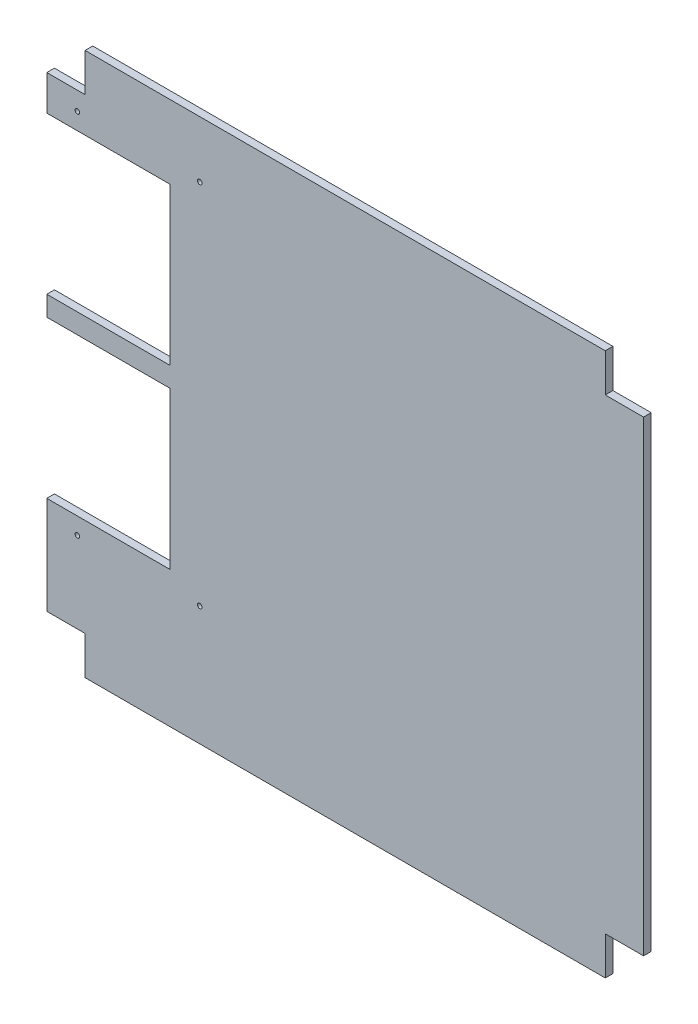
ISO-10303-21;
HEADER;
FILE_DESCRIPTION(('STEP AP214'),'2;1');
FILE_NAME('part.step','',(''),(''),'','','');
FILE_SCHEMA(('AUTOMOTIVE_DESIGN { 1 0 10303 214 1 1 1 1 }'));
ENDSEC;
DATA;
#1=APPLICATION_CONTEXT('core data for automotive mechanical design processes');
#2=APPLICATION_PROTOCOL_DEFINITION('international standard','automotive_design',2000,#1);
#3=PRODUCT_CONTEXT('',#1,'mechanical');
#4=PRODUCT('Part','Part','',(#3));
#5=PRODUCT_RELATED_PRODUCT_CATEGORY('part','',(#4));
#6=PRODUCT_DEFINITION_FORMATION('','',#4);
#7=PRODUCT_DEFINITION_CONTEXT('part definition',#1,'design');
#8=PRODUCT_DEFINITION('design','',#6,#7);
#9=PRODUCT_DEFINITION_SHAPE('','',#8);
#10=(LENGTH_UNIT() NAMED_UNIT(*) SI_UNIT(.MILLI.,.METRE.));
#11=(NAMED_UNIT(*) PLANE_ANGLE_UNIT() SI_UNIT($,.RADIAN.));
#12=(NAMED_UNIT(*) SI_UNIT($,.STERADIAN.) SOLID_ANGLE_UNIT());
#13=UNCERTAINTY_MEASURE_WITH_UNIT(LENGTH_MEASURE(1.E-05),#10,'distance_accuracy_value','');
#14=(GEOMETRIC_REPRESENTATION_CONTEXT(3) GLOBAL_UNCERTAINTY_ASSIGNED_CONTEXT((#13)) GLOBAL_UNIT_ASSIGNED_CONTEXT((#10,
#11,#12)) REPRESENTATION_CONTEXT('',''));
#15=CARTESIAN_POINT('',(0.,0.,0.));
#16=DIRECTION('',(0.,0.,1.));
#17=DIRECTION('',(1.,0.,0.));
#18=AXIS2_PLACEMENT_3D('',#15,#16,#17);
#19=CARTESIAN_POINT('',(-195.,177.5,5.));
#20=DIRECTION('',(1.,0.,0.));
#21=DIRECTION('',(0.,1.,0.));
#22=AXIS2_PLACEMENT_3D('',#19,#20,#21);
#23=PLANE('',#22);
#24=DIRECTION('',(0.,-1.,0.));
#25=VECTOR('',#24,1.);
#26=CARTESIAN_POINT('',(-195.,177.5,0.));
#27=LINE('',#26,#25);
#28=CARTESIAN_POINT('',(-195.,27.,0.));
#29=VERTEX_POINT('',#28);
#30=CARTESIAN_POINT('',(-195.,13.9988010097694,0.));
#31=VERTEX_POINT('',#30);
#32=EDGE_CURVE('E195',#29,#31,#27,.T.);
#33=ORIENTED_EDGE('',*,*,#32,.T.);
#34=DIRECTION('',(0.,0.,-1.));
#35=VECTOR('',#34,1.);
#36=CARTESIAN_POINT('',(-195.,13.9988010097694,5.));
#37=LINE('',#36,#35);
#38=CARTESIAN_POINT('',(-195.,13.9988010097694,5.));
#39=VERTEX_POINT('',#38);
#40=EDGE_CURVE('E191',#39,#31,#37,.T.);
#41=ORIENTED_EDGE('',*,*,#40,.F.);
#42=DIRECTION('',(0.,-1.,0.));
#43=VECTOR('',#42,1.);
#44=CARTESIAN_POINT('',(-195.,177.5,5.));
#45=LINE('',#44,#43);
#46=CARTESIAN_POINT('',(-195.,27.,5.));
#47=VERTEX_POINT('',#46);
#48=EDGE_CURVE('E175',#47,#39,#45,.T.);
#49=ORIENTED_EDGE('',*,*,#48,.F.);
#50=DIRECTION('',(0.,0.,-1.));
#51=VECTOR('',#50,1.);
#52=CARTESIAN_POINT('',(-195.,27.,10.));
#53=LINE('',#52,#51);
#54=EDGE_CURVE('E271',#47,#29,#53,.T.);
#55=ORIENTED_EDGE('',*,*,#54,.T.);
#56=EDGE_LOOP('',(#33,#41,#49,#55));
#57=FACE_BOUND('',#56,.T.);
#58=ADVANCED_FACE('F36',(#57),#23,.F.);
#59=CARTESIAN_POINT('',(-195.,152.47,5.));
#60=VERTEX_POINT('',#59);
#61=CARTESIAN_POINT('',(-195.,129.5,5.));
#62=VERTEX_POINT('',#61);
#63=EDGE_CURVE('E45',#60,#62,#45,.T.);
#64=ORIENTED_EDGE('',*,*,#63,.F.);
#65=DIRECTION('',(0.,0.,-1.));
#66=VECTOR('',#65,1.);
#67=CARTESIAN_POINT('',(-195.,152.47,10.));
#68=LINE('',#67,#66);
#69=CARTESIAN_POINT('',(-195.,152.47,0.));
#70=VERTEX_POINT('',#69);
#71=EDGE_CURVE('E223',#60,#70,#68,.T.);
#72=ORIENTED_EDGE('',*,*,#71,.T.);
#73=CARTESIAN_POINT('',(-195.,129.5,0.));
#74=VERTEX_POINT('',#73);
#75=EDGE_CURVE('E313',#70,#74,#27,.T.);
#76=ORIENTED_EDGE('',*,*,#75,.T.);
#77=DIRECTION('',(0.,0.,-1.));
#78=VECTOR('',#77,1.);
#79=CARTESIAN_POINT('',(-195.,129.5,10.));
#80=LINE('',#79,#78);
#81=EDGE_CURVE('E269',#62,#74,#80,.T.);
#82=ORIENTED_EDGE('',*,*,#81,.F.);
#83=EDGE_LOOP('',(#64,#72,#76,#82));
#84=FACE_BOUND('',#83,.T.);
#85=ADVANCED_FACE('F376',(#84),#23,.F.);
#86=CARTESIAN_POINT('',(195.,177.5,5.));
#87=DIRECTION('',(-1.,0.,0.));
#88=DIRECTION('',(0.,-1.,0.));
#89=AXIS2_PLACEMENT_3D('',#86,#87,#88);
#90=PLANE('',#89);
#91=DIRECTION('',(0.,1.,0.));
#92=VECTOR('',#91,1.);
#93=CARTESIAN_POINT('',(195.,177.5,0.));
#94=LINE('',#93,#92);
#95=CARTESIAN_POINT('',(195.,-152.47,0.));
#96=VERTEX_POINT('',#95);
#97=CARTESIAN_POINT('',(195.,152.47,0.));
#98=VERTEX_POINT('',#97);
#99=EDGE_CURVE('E299',#96,#98,#94,.T.);
#100=ORIENTED_EDGE('',*,*,#99,.T.);
#101=DIRECTION('',(0.,0.,-1.));
#102=VECTOR('',#101,1.);
#103=CARTESIAN_POINT('',(195.,152.47,10.));
#104=LINE('',#103,#102);
#105=CARTESIAN_POINT('',(195.,152.47,5.));
#106=VERTEX_POINT('',#105);
#107=EDGE_CURVE('E254',#106,#98,#104,.T.);
#108=ORIENTED_EDGE('',*,*,#107,.F.);
#109=DIRECTION('',(0.,1.,0.));
#110=VECTOR('',#109,1.);
#111=CARTESIAN_POINT('',(195.,177.5,5.));
#112=LINE('',#111,#110);
#113=CARTESIAN_POINT('',(195.,-152.47,5.));
#114=VERTEX_POINT('',#113);
#115=EDGE_CURVE('E300',#114,#106,#112,.T.);
#116=ORIENTED_EDGE('',*,*,#115,.F.);
#117=DIRECTION('',(0.,0.,-1.));
#118=VECTOR('',#117,1.);
#119=CARTESIAN_POINT('',(195.,-152.47,10.));
#120=LINE('',#119,#118);
#121=EDGE_CURVE('E209',#114,#96,#120,.T.);
#122=ORIENTED_EDGE('',*,*,#121,.T.);
#123=EDGE_LOOP('',(#100,#108,#116,#122));
#124=FACE_BOUND('',#123,.T.);
#125=ADVANCED_FACE('F38',(#124),#90,.F.);
#126=CARTESIAN_POINT('',(-195.,177.5,5.));
#127=DIRECTION('',(0.,-1.,0.));
#128=DIRECTION('',(0.,0.,-1.));
#129=AXIS2_PLACEMENT_3D('',#126,#127,#128);
#130=PLANE('',#129);
#131=DIRECTION('',(-1.,0.,0.));
#132=VECTOR('',#131,1.);
#133=CARTESIAN_POINT('',(-195.,177.5,0.));
#134=LINE('',#133,#132);
#135=CARTESIAN_POINT('',(169.97,177.5,0.));
#136=VERTEX_POINT('',#135);
#137=CARTESIAN_POINT('',(-169.97,177.5,0.));
#138=VERTEX_POINT('',#137);
#139=EDGE_CURVE('E309',#136,#138,#134,.T.);
#140=ORIENTED_EDGE('',*,*,#139,.T.);
#141=DIRECTION('',(0.,0.,-1.));
#142=VECTOR('',#141,1.);
#143=CARTESIAN_POINT('',(-169.97,177.5,10.));
#144=LINE('',#143,#142);
#145=CARTESIAN_POINT('',(-169.97,177.5,5.));
#146=VERTEX_POINT('',#145);
#147=EDGE_CURVE('E220',#146,#138,#144,.T.);
#148=ORIENTED_EDGE('',*,*,#147,.F.);
#149=DIRECTION('',(-1.,0.,0.));
#150=VECTOR('',#149,1.);
#151=CARTESIAN_POINT('',(-195.,177.5,5.));
#152=LINE('',#151,#150);
#153=CARTESIAN_POINT('',(169.97,177.5,5.));
#154=VERTEX_POINT('',#153);
#155=EDGE_CURVE('E303',#154,#146,#152,.T.);
#156=ORIENTED_EDGE('',*,*,#155,.F.);
#157=DIRECTION('',(0.,0.,-1.));
#158=VECTOR('',#157,1.);
#159=CARTESIAN_POINT('',(169.97,177.5,10.));
#160=LINE('',#159,#158);
#161=EDGE_CURVE('E241',#154,#136,#160,.T.);
#162=ORIENTED_EDGE('',*,*,#161,.T.);
#163=EDGE_LOOP('',(#140,#148,#156,#162));
#164=FACE_BOUND('',#163,.T.);
#165=ADVANCED_FACE('F357',(#164),#130,.F.);
#166=CARTESIAN_POINT('',(-195.,-88.4999999999999,0.));
#167=VERTEX_POINT('',#166);
#168=CARTESIAN_POINT('',(-195.,-152.47,0.));
#169=VERTEX_POINT('',#168);
#170=EDGE_CURVE('E311',#167,#169,#27,.T.);
#171=ORIENTED_EDGE('',*,*,#170,.T.);
#172=DIRECTION('',(0.,0.,-1.));
#173=VECTOR('',#172,1.);
#174=CARTESIAN_POINT('',(-195.,-152.47,10.));
#175=LINE('',#174,#173);
#176=CARTESIAN_POINT('',(-195.,-152.47,5.));
#177=VERTEX_POINT('',#176);
#178=EDGE_CURVE('E217',#177,#169,#175,.T.);
#179=ORIENTED_EDGE('',*,*,#178,.F.);
#180=CARTESIAN_POINT('',(-195.,-88.4999999999999,5.));
#181=VERTEX_POINT('',#180);
#182=EDGE_CURVE('E185',#181,#177,#45,.T.);
#183=ORIENTED_EDGE('',*,*,#182,.F.);
#184=DIRECTION('',(0.,0.,-1.));
#185=VECTOR('',#184,1.);
#186=CARTESIAN_POINT('',(-195.,-88.4999999999999,10.));
#187=LINE('',#186,#185);
#188=EDGE_CURVE('E244',#181,#167,#187,.T.);
#189=ORIENTED_EDGE('',*,*,#188,.T.);
#190=EDGE_LOOP('',(#171,#179,#183,#189));
#191=FACE_BOUND('',#190,.T.);
#192=ADVANCED_FACE('F388',(#191),#23,.F.);
#193=CARTESIAN_POINT('',(-195.,-177.5,5.));
#194=DIRECTION('',(0.,1.,0.));
#195=DIRECTION('',(0.,0.,1.));
#196=AXIS2_PLACEMENT_3D('',#193,#194,#195);
#197=PLANE('',#196);
#198=DIRECTION('',(1.,0.,0.));
#199=VECTOR('',#198,1.);
#200=CARTESIAN_POINT('',(-195.,-177.5,5.));
#201=LINE('',#200,#199);
#202=CARTESIAN_POINT('',(-169.97,-177.5,5.));
#203=VERTEX_POINT('',#202);
#204=CARTESIAN_POINT('',(169.97,-177.5,5.));
#205=VERTEX_POINT('',#204);
#206=EDGE_CURVE('E11',#203,#205,#201,.T.);
#207=ORIENTED_EDGE('',*,*,#206,.F.);
#208=DIRECTION('',(0.,0.,-1.));
#209=VECTOR('',#208,1.);
#210=CARTESIAN_POINT('',(-169.97,-177.5,10.));
#211=LINE('',#210,#209);
#212=CARTESIAN_POINT('',(-169.97,-177.5,0.));
#213=VERTEX_POINT('',#212);
#214=EDGE_CURVE('E233',#203,#213,#211,.T.);
#215=ORIENTED_EDGE('',*,*,#214,.T.);
#216=DIRECTION('',(1.,0.,0.));
#217=VECTOR('',#216,1.);
#218=CARTESIAN_POINT('',(-195.,-177.5,0.));
#219=LINE('',#218,#217);
#220=CARTESIAN_POINT('',(169.97,-177.5,0.));
#221=VERTEX_POINT('',#220);
#222=EDGE_CURVE('E40',#213,#221,#219,.T.);
#223=ORIENTED_EDGE('',*,*,#222,.T.);
#224=DIRECTION('',(0.,0.,-1.));
#225=VECTOR('',#224,1.);
#226=CARTESIAN_POINT('',(169.97,-177.5,10.));
#227=LINE('',#226,#225);
#228=EDGE_CURVE('E206',#205,#221,#227,.T.);
#229=ORIENTED_EDGE('',*,*,#228,.F.);
#230=EDGE_LOOP('',(#207,#215,#223,#229));
#231=FACE_BOUND('',#230,.T.);
#232=ADVANCED_FACE('F326',(#231),#197,.F.);
#233=CARTESIAN_POINT('',(0.,0.,5.));
#234=DIRECTION('',(0.,0.,1.));
#235=DIRECTION('',(1.,0.,0.));
#236=AXIS2_PLACEMENT_3D('',#233,#234,#235);
#237=PLANE('',#236);
#238=CARTESIAN_POINT('',(-175.,140.5,5.));
#239=DIRECTION('',(0.,0.,-1.));
#240=DIRECTION('',(1.,0.,0.));
#241=AXIS2_PLACEMENT_3D('',#238,#239,#240);
#242=CIRCLE('',#241,1.49999999999994);
#243=CARTESIAN_POINT('',(-173.5,140.5,5.));
#244=VERTEX_POINT('',#243);
#245=EDGE_CURVE('E621',#244,#244,#242,.T.);
#246=ORIENTED_EDGE('',*,*,#245,.T.);
#247=EDGE_LOOP('',(#246));
#248=FACE_BOUND('',#247,.T.);
#249=CARTESIAN_POINT('',(-95.,140.5,5.));
#250=DIRECTION('',(0.,0.,-1.));
#251=DIRECTION('',(-1.,0.,0.));
#252=AXIS2_PLACEMENT_3D('',#249,#250,#251);
#253=CIRCLE('',#252,1.5);
#254=CARTESIAN_POINT('',(-96.5,140.5,5.));
#255=VERTEX_POINT('',#254);
#256=EDGE_CURVE('E644',#255,#255,#253,.T.);
#257=ORIENTED_EDGE('',*,*,#256,.T.);
#258=EDGE_LOOP('',(#257));
#259=FACE_BOUND('',#258,.T.);
#260=CARTESIAN_POINT('',(-95.,-99.5000000000001,5.));
#261=DIRECTION('',(0.,0.,-1.));
#262=DIRECTION('',(1.,0.,0.));
#263=AXIS2_PLACEMENT_3D('',#260,#261,#262);
#264=CIRCLE('',#263,1.5);
#265=CARTESIAN_POINT('',(-93.5,-99.5000000000001,5.));
#266=VERTEX_POINT('',#265);
#267=EDGE_CURVE('E635',#266,#266,#264,.T.);
#268=ORIENTED_EDGE('',*,*,#267,.T.);
#269=EDGE_LOOP('',(#268));
#270=FACE_BOUND('',#269,.T.);
#271=CARTESIAN_POINT('',(-175.,-99.5000000000001,5.));
#272=DIRECTION('',(0.,0.,-1.));
#273=DIRECTION('',(-1.,0.,0.));
#274=AXIS2_PLACEMENT_3D('',#271,#272,#273);
#275=CIRCLE('',#274,1.5);
#276=CARTESIAN_POINT('',(-176.5,-99.5000000000001,5.));
#277=VERTEX_POINT('',#276);
#278=EDGE_CURVE('E630',#277,#277,#275,.T.);
#279=ORIENTED_EDGE('',*,*,#278,.T.);
#280=EDGE_LOOP('',(#279));
#281=FACE_BOUND('',#280,.T.);
#282=DIRECTION('',(-1.,0.,0.));
#283=VECTOR('',#282,1.);
#284=CARTESIAN_POINT('',(0.,-152.47,5.));
#285=LINE('',#284,#283);
#286=CARTESIAN_POINT('',(-169.97,-152.47,5.));
#287=VERTEX_POINT('',#286);
#288=EDGE_CURVE('E297',#287,#177,#285,.T.);
#289=ORIENTED_EDGE('',*,*,#288,.F.);
#290=DIRECTION('',(0.,1.,0.));
#291=VECTOR('',#290,1.);
#292=CARTESIAN_POINT('',(-169.97,0.,5.));
#293=LINE('',#292,#291);
#294=EDGE_CURVE('E295',#203,#287,#293,.T.);
#295=ORIENTED_EDGE('',*,*,#294,.F.);
#296=ORIENTED_EDGE('',*,*,#206,.T.);
#297=DIRECTION('',(0.,-1.,0.));
#298=VECTOR('',#297,1.);
#299=CARTESIAN_POINT('',(169.97,0.,5.));
#300=LINE('',#299,#298);
#301=CARTESIAN_POINT('',(169.97,-152.47,5.));
#302=VERTEX_POINT('',#301);
#303=EDGE_CURVE('E282',#302,#205,#300,.T.);
#304=ORIENTED_EDGE('',*,*,#303,.F.);
#305=DIRECTION('',(-1.,0.,0.));
#306=VECTOR('',#305,1.);
#307=CARTESIAN_POINT('',(0.,-152.47,5.));
#308=LINE('',#307,#306);
#309=EDGE_CURVE('E280',#114,#302,#308,.T.);
#310=ORIENTED_EDGE('',*,*,#309,.F.);
#311=ORIENTED_EDGE('',*,*,#115,.T.);
#312=DIRECTION('',(1.,0.,0.));
#313=VECTOR('',#312,1.);
#314=CARTESIAN_POINT('',(0.,152.47,5.));
#315=LINE('',#314,#313);
#316=CARTESIAN_POINT('',(169.97,152.47,5.));
#317=VERTEX_POINT('',#316);
#318=EDGE_CURVE('E287',#317,#106,#315,.T.);
#319=ORIENTED_EDGE('',*,*,#318,.F.);
#320=DIRECTION('',(0.,-1.,0.));
#321=VECTOR('',#320,1.);
#322=CARTESIAN_POINT('',(169.97,0.,5.));
#323=LINE('',#322,#321);
#324=EDGE_CURVE('E289',#154,#317,#323,.T.);
#325=ORIENTED_EDGE('',*,*,#324,.F.);
#326=ORIENTED_EDGE('',*,*,#155,.T.);
#327=DIRECTION('',(0.,1.,0.));
#328=VECTOR('',#327,1.);
#329=CARTESIAN_POINT('',(-169.97,0.,5.));
#330=LINE('',#329,#328);
#331=CARTESIAN_POINT('',(-169.97,152.47,5.));
#332=VERTEX_POINT('',#331);
#333=EDGE_CURVE('E293',#332,#146,#330,.T.);
#334=ORIENTED_EDGE('',*,*,#333,.F.);
#335=DIRECTION('',(1.,0.,0.));
#336=VECTOR('',#335,1.);
#337=CARTESIAN_POINT('',(0.,152.47,5.));
#338=LINE('',#337,#336);
#339=EDGE_CURVE('E291',#60,#332,#338,.T.);
#340=ORIENTED_EDGE('',*,*,#339,.F.);
#341=ORIENTED_EDGE('',*,*,#63,.T.);
#342=DIRECTION('',(-1.,0.,0.));
#343=VECTOR('',#342,1.);
#344=CARTESIAN_POINT('',(0.,129.5,5.));
#345=LINE('',#344,#343);
#346=CARTESIAN_POINT('',(-114.565527814996,129.5,5.));
#347=VERTEX_POINT('',#346);
#348=EDGE_CURVE('E276',#347,#62,#345,.T.);
#349=ORIENTED_EDGE('',*,*,#348,.F.);
#350=DIRECTION('',(0.,1.,0.));
#351=VECTOR('',#350,1.);
#352=CARTESIAN_POINT('',(-114.565527814996,0.,5.));
#353=LINE('',#352,#351);
#354=CARTESIAN_POINT('',(-114.565527814996,27.,5.));
#355=VERTEX_POINT('',#354);
#356=EDGE_CURVE('E278',#355,#347,#353,.T.);
#357=ORIENTED_EDGE('',*,*,#356,.F.);
#358=DIRECTION('',(1.,0.,0.));
#359=VECTOR('',#358,1.);
#360=CARTESIAN_POINT('',(0.,27.,5.));
#361=LINE('',#360,#359);
#362=EDGE_CURVE('E181',#47,#355,#361,.T.);
#363=ORIENTED_EDGE('',*,*,#362,.F.);
#364=ORIENTED_EDGE('',*,*,#48,.T.);
#365=DIRECTION('',(-1.,0.,0.));
#366=VECTOR('',#365,1.);
#367=CARTESIAN_POINT('',(-114.565527814996,13.9988010097694,5.));
#368=LINE('',#367,#366);
#369=CARTESIAN_POINT('',(-114.565527814996,13.9988010097694,5.));
#370=VERTEX_POINT('',#369);
#371=EDGE_CURVE('E179',#370,#39,#368,.T.);
#372=ORIENTED_EDGE('',*,*,#371,.F.);
#373=DIRECTION('',(0.,1.,0.));
#374=VECTOR('',#373,1.);
#375=CARTESIAN_POINT('',(-114.565527814996,0.,5.));
#376=LINE('',#375,#374);
#377=CARTESIAN_POINT('',(-114.565527814996,-88.4999999999999,5.));
#378=VERTEX_POINT('',#377);
#379=EDGE_CURVE('E58',#378,#370,#376,.T.);
#380=ORIENTED_EDGE('',*,*,#379,.F.);
#381=DIRECTION('',(1.,0.,0.));
#382=VECTOR('',#381,1.);
#383=CARTESIAN_POINT('',(0.,-88.4999999999999,5.));
#384=LINE('',#383,#382);
#385=EDGE_CURVE('E284',#181,#378,#384,.T.);
#386=ORIENTED_EDGE('',*,*,#385,.F.);
#387=ORIENTED_EDGE('',*,*,#182,.T.);
#388=EDGE_LOOP('',(#289,#295,#296,#304,#310,#311,#319,#325,#326,#334,#340,#341,#349,#357,#363,
#364,#372,#380,#386,#387));
#389=FACE_BOUND('',#388,.T.);
#390=ADVANCED_FACE('F178',(#248,#259,#270,#281,#389),#237,.T.);
#391=CARTESIAN_POINT('',(0.,0.,0.));
#392=DIRECTION('',(0.,0.,1.));
#393=DIRECTION('',(1.,0.,0.));
#394=AXIS2_PLACEMENT_3D('',#391,#392,#393);
#395=PLANE('',#394);
#396=CARTESIAN_POINT('',(-175.,140.5,0.));
#397=DIRECTION('',(0.,0.,-1.));
#398=DIRECTION('',(1.,0.,0.));
#399=AXIS2_PLACEMENT_3D('',#396,#397,#398);
#400=CIRCLE('',#399,1.49999999999994);
#401=CARTESIAN_POINT('',(-173.5,140.5,0.));
#402=VERTEX_POINT('',#401);
#403=EDGE_CURVE('E624',#402,#402,#400,.T.);
#404=ORIENTED_EDGE('',*,*,#403,.F.);
#405=EDGE_LOOP('',(#404));
#406=FACE_BOUND('',#405,.T.);
#407=CARTESIAN_POINT('',(-95.,140.5,0.));
#408=DIRECTION('',(0.,0.,-1.));
#409=DIRECTION('',(-1.,0.,0.));
#410=AXIS2_PLACEMENT_3D('',#407,#408,#409);
#411=CIRCLE('',#410,1.5);
#412=CARTESIAN_POINT('',(-96.5,140.5,0.));
#413=VERTEX_POINT('',#412);
#414=EDGE_CURVE('E626',#413,#413,#411,.T.);
#415=ORIENTED_EDGE('',*,*,#414,.F.);
#416=EDGE_LOOP('',(#415));
#417=FACE_BOUND('',#416,.T.);
#418=CARTESIAN_POINT('',(-95.,-99.5000000000001,0.));
#419=DIRECTION('',(0.,0.,-1.));
#420=DIRECTION('',(1.,0.,0.));
#421=AXIS2_PLACEMENT_3D('',#418,#419,#420);
#422=CIRCLE('',#421,1.5);
#423=CARTESIAN_POINT('',(-93.5,-99.5000000000001,0.));
#424=VERTEX_POINT('',#423);
#425=EDGE_CURVE('E639',#424,#424,#422,.T.);
#426=ORIENTED_EDGE('',*,*,#425,.F.);
#427=EDGE_LOOP('',(#426));
#428=FACE_BOUND('',#427,.T.);
#429=CARTESIAN_POINT('',(-175.,-99.5000000000001,0.));
#430=DIRECTION('',(0.,0.,-1.));
#431=DIRECTION('',(-1.,0.,0.));
#432=AXIS2_PLACEMENT_3D('',#429,#430,#431);
#433=CIRCLE('',#432,1.5);
#434=CARTESIAN_POINT('',(-176.5,-99.5000000000001,0.));
#435=VERTEX_POINT('',#434);
#436=EDGE_CURVE('E633',#435,#435,#433,.T.);
#437=ORIENTED_EDGE('',*,*,#436,.F.);
#438=EDGE_LOOP('',(#437));
#439=FACE_BOUND('',#438,.T.);
#440=DIRECTION('',(0.,-1.,0.));
#441=VECTOR('',#440,1.);
#442=CARTESIAN_POINT('',(-114.565527814996,15.3788010097694,0.));
#443=LINE('',#442,#441);
#444=CARTESIAN_POINT('',(-114.565527814996,13.9988010097694,0.));
#445=VERTEX_POINT('',#444);
#446=CARTESIAN_POINT('',(-114.565527814996,-88.4999999999999,0.));
#447=VERTEX_POINT('',#446);
#448=EDGE_CURVE('E238',#445,#447,#443,.T.);
#449=ORIENTED_EDGE('',*,*,#448,.F.);
#450=DIRECTION('',(1.,0.,0.));
#451=VECTOR('',#450,1.);
#452=CARTESIAN_POINT('',(-195.,13.9988010097694,0.));
#453=LINE('',#452,#451);
#454=EDGE_CURVE('E196',#31,#445,#453,.T.);
#455=ORIENTED_EDGE('',*,*,#454,.F.);
#456=ORIENTED_EDGE('',*,*,#32,.F.);
#457=DIRECTION('',(-1.,0.,0.));
#458=VECTOR('',#457,1.);
#459=CARTESIAN_POINT('',(-114.565527814996,27.,0.));
#460=LINE('',#459,#458);
#461=CARTESIAN_POINT('',(-114.565527814996,27.,0.));
#462=VERTEX_POINT('',#461);
#463=EDGE_CURVE('E261',#462,#29,#460,.T.);
#464=ORIENTED_EDGE('',*,*,#463,.F.);
#465=DIRECTION('',(0.,-1.,0.));
#466=VECTOR('',#465,1.);
#467=CARTESIAN_POINT('',(-114.565527814996,129.5,0.));
#468=LINE('',#467,#466);
#469=CARTESIAN_POINT('',(-114.565527814996,129.5,0.));
#470=VERTEX_POINT('',#469);
#471=EDGE_CURVE('E247',#470,#462,#468,.T.);
#472=ORIENTED_EDGE('',*,*,#471,.F.);
#473=DIRECTION('',(1.,0.,0.));
#474=VECTOR('',#473,1.);
#475=CARTESIAN_POINT('',(-114.565527814996,129.5,0.));
#476=LINE('',#475,#474);
#477=EDGE_CURVE('E263',#74,#470,#476,.T.);
#478=ORIENTED_EDGE('',*,*,#477,.F.);
#479=ORIENTED_EDGE('',*,*,#75,.F.);
#480=DIRECTION('',(-1.,0.,0.));
#481=VECTOR('',#480,1.);
#482=CARTESIAN_POINT('',(-169.97,152.47,0.));
#483=LINE('',#482,#481);
#484=CARTESIAN_POINT('',(-169.97,152.47,0.));
#485=VERTEX_POINT('',#484);
#486=EDGE_CURVE('E216',#485,#70,#483,.T.);
#487=ORIENTED_EDGE('',*,*,#486,.F.);
#488=DIRECTION('',(0.,-1.,0.));
#489=VECTOR('',#488,1.);
#490=CARTESIAN_POINT('',(-169.97,152.47,0.));
#491=LINE('',#490,#489);
#492=EDGE_CURVE('E214',#138,#485,#491,.T.);
#493=ORIENTED_EDGE('',*,*,#492,.F.);
#494=ORIENTED_EDGE('',*,*,#139,.F.);
#495=DIRECTION('',(0.,1.,0.));
#496=VECTOR('',#495,1.);
#497=CARTESIAN_POINT('',(169.97,152.47,0.));
#498=LINE('',#497,#496);
#499=CARTESIAN_POINT('',(169.97,152.47,0.));
#500=VERTEX_POINT('',#499);
#501=EDGE_CURVE('E252',#500,#136,#498,.T.);
#502=ORIENTED_EDGE('',*,*,#501,.F.);
#503=DIRECTION('',(-1.,0.,0.));
#504=VECTOR('',#503,1.);
#505=CARTESIAN_POINT('',(169.97,152.47,0.));
#506=LINE('',#505,#504);
#507=EDGE_CURVE('E222',#98,#500,#506,.T.);
#508=ORIENTED_EDGE('',*,*,#507,.F.);
#509=ORIENTED_EDGE('',*,*,#99,.F.);
#510=DIRECTION('',(1.,0.,0.));
#511=VECTOR('',#510,1.);
#512=CARTESIAN_POINT('',(169.97,-152.47,0.));
#513=LINE('',#512,#511);
#514=CARTESIAN_POINT('',(169.97,-152.47,0.));
#515=VERTEX_POINT('',#514);
#516=EDGE_CURVE('E203',#515,#96,#513,.T.);
#517=ORIENTED_EDGE('',*,*,#516,.F.);
#518=DIRECTION('',(0.,1.,0.));
#519=VECTOR('',#518,1.);
#520=CARTESIAN_POINT('',(169.97,-152.47,0.));
#521=LINE('',#520,#519);
#522=EDGE_CURVE('E198',#221,#515,#521,.T.);
#523=ORIENTED_EDGE('',*,*,#522,.F.);
#524=ORIENTED_EDGE('',*,*,#222,.F.);
#525=DIRECTION('',(0.,-1.,0.));
#526=VECTOR('',#525,1.);
#527=CARTESIAN_POINT('',(-169.97,-152.47,0.));
#528=LINE('',#527,#526);
#529=CARTESIAN_POINT('',(-169.97,-152.47,0.));
#530=VERTEX_POINT('',#529);
#531=EDGE_CURVE('E229',#530,#213,#528,.T.);
#532=ORIENTED_EDGE('',*,*,#531,.F.);
#533=DIRECTION('',(1.,0.,0.));
#534=VECTOR('',#533,1.);
#535=CARTESIAN_POINT('',(-169.97,-152.47,0.));
#536=LINE('',#535,#534);
#537=EDGE_CURVE('E208',#169,#530,#536,.T.);
#538=ORIENTED_EDGE('',*,*,#537,.F.);
#539=ORIENTED_EDGE('',*,*,#170,.F.);
#540=DIRECTION('',(-1.,0.,0.));
#541=VECTOR('',#540,1.);
#542=CARTESIAN_POINT('',(-114.565527814996,-88.4999999999999,0.));
#543=LINE('',#542,#541);
#544=EDGE_CURVE('E240',#447,#167,#543,.T.);
#545=ORIENTED_EDGE('',*,*,#544,.F.);
#546=EDGE_LOOP('',(#449,#455,#456,#464,#472,#478,#479,#487,#493,#494,#502,#508,#509,#517,#523,
#524,#532,#538,#539,#545));
#547=FACE_BOUND('',#546,.T.);
#548=ADVANCED_FACE('F330',(#406,#417,#428,#439,#547),#395,.F.);
#549=CARTESIAN_POINT('',(-114.565527814996,129.5,10.));
#550=DIRECTION('',(1.,0.,0.));
#551=DIRECTION('',(0.,1.,0.));
#552=AXIS2_PLACEMENT_3D('',#549,#550,#551);
#553=PLANE('',#552);
#554=ORIENTED_EDGE('',*,*,#356,.T.);
#555=DIRECTION('',(0.,0.,-1.));
#556=VECTOR('',#555,1.);
#557=CARTESIAN_POINT('',(-114.565527814996,129.5,10.));
#558=LINE('',#557,#556);
#559=EDGE_CURVE('E267',#347,#470,#558,.T.);
#560=ORIENTED_EDGE('',*,*,#559,.T.);
#561=ORIENTED_EDGE('',*,*,#471,.T.);
#562=DIRECTION('',(0.,0.,-1.));
#563=VECTOR('',#562,1.);
#564=CARTESIAN_POINT('',(-114.565527814996,27.,10.));
#565=LINE('',#564,#563);
#566=EDGE_CURVE('E266',#355,#462,#565,.T.);
#567=ORIENTED_EDGE('',*,*,#566,.F.);
#568=EDGE_LOOP('',(#554,#560,#561,#567));
#569=FACE_BOUND('',#568,.T.);
#570=ADVANCED_FACE('F379',(#569),#553,.F.);
#571=CARTESIAN_POINT('',(-114.565527814996,129.5,10.));
#572=DIRECTION('',(0.,1.,0.));
#573=DIRECTION('',(0.,0.,1.));
#574=AXIS2_PLACEMENT_3D('',#571,#572,#573);
#575=PLANE('',#574);
#576=ORIENTED_EDGE('',*,*,#348,.T.);
#577=ORIENTED_EDGE('',*,*,#81,.T.);
#578=ORIENTED_EDGE('',*,*,#477,.T.);
#579=ORIENTED_EDGE('',*,*,#559,.F.);
#580=EDGE_LOOP('',(#576,#577,#578,#579));
#581=FACE_BOUND('',#580,.T.);
#582=ADVANCED_FACE('F374',(#581),#575,.F.);
#583=CARTESIAN_POINT('',(-114.565527814996,27.,10.));
#584=DIRECTION('',(0.,-1.,0.));
#585=DIRECTION('',(0.,0.,-1.));
#586=AXIS2_PLACEMENT_3D('',#583,#584,#585);
#587=PLANE('',#586);
#588=ORIENTED_EDGE('',*,*,#362,.T.);
#589=ORIENTED_EDGE('',*,*,#566,.T.);
#590=ORIENTED_EDGE('',*,*,#463,.T.);
#591=ORIENTED_EDGE('',*,*,#54,.F.);
#592=EDGE_LOOP('',(#588,#589,#590,#591));
#593=FACE_BOUND('',#592,.T.);
#594=ADVANCED_FACE('F381',(#593),#587,.F.);
#595=CARTESIAN_POINT('',(169.97,-152.47,10.));
#596=DIRECTION('',(-1.,0.,0.));
#597=DIRECTION('',(0.,0.,1.));
#598=AXIS2_PLACEMENT_3D('',#595,#596,#597);
#599=PLANE('',#598);
#600=ORIENTED_EDGE('',*,*,#303,.T.);
#601=ORIENTED_EDGE('',*,*,#228,.T.);
#602=ORIENTED_EDGE('',*,*,#522,.T.);
#603=DIRECTION('',(0.,0.,-1.));
#604=VECTOR('',#603,1.);
#605=CARTESIAN_POINT('',(169.97,-152.47,10.));
#606=LINE('',#605,#604);
#607=EDGE_CURVE('E205',#302,#515,#606,.T.);
#608=ORIENTED_EDGE('',*,*,#607,.F.);
#609=EDGE_LOOP('',(#600,#601,#602,#608));
#610=FACE_BOUND('',#609,.T.);
#611=ADVANCED_FACE('F336',(#610),#599,.F.);
#612=CARTESIAN_POINT('',(169.97,-152.47,10.));
#613=DIRECTION('',(0.,1.,0.));
#614=DIRECTION('',(0.,0.,1.));
#615=AXIS2_PLACEMENT_3D('',#612,#613,#614);
#616=PLANE('',#615);
#617=ORIENTED_EDGE('',*,*,#309,.T.);
#618=ORIENTED_EDGE('',*,*,#607,.T.);
#619=ORIENTED_EDGE('',*,*,#516,.T.);
#620=ORIENTED_EDGE('',*,*,#121,.F.);
#621=EDGE_LOOP('',(#617,#618,#619,#620));
#622=FACE_BOUND('',#621,.T.);
#623=ADVANCED_FACE('F339',(#622),#616,.F.);
#624=CARTESIAN_POINT('',(-114.565527814996,15.3788010097694,10.));
#625=DIRECTION('',(1.,0.,0.));
#626=DIRECTION('',(0.,0.,-1.));
#627=AXIS2_PLACEMENT_3D('',#624,#625,#626);
#628=PLANE('',#627);
#629=ORIENTED_EDGE('',*,*,#379,.T.);
#630=DIRECTION('',(0.,0.,1.));
#631=VECTOR('',#630,1.);
#632=CARTESIAN_POINT('',(-114.565527814996,13.9988010097694,0.));
#633=LINE('',#632,#631);
#634=EDGE_CURVE('E53',#445,#370,#633,.T.);
#635=ORIENTED_EDGE('',*,*,#634,.F.);
#636=ORIENTED_EDGE('',*,*,#448,.T.);
#637=DIRECTION('',(0.,0.,-1.));
#638=VECTOR('',#637,1.);
#639=CARTESIAN_POINT('',(-114.565527814996,-88.4999999999999,10.));
#640=LINE('',#639,#638);
#641=EDGE_CURVE('E243',#378,#447,#640,.T.);
#642=ORIENTED_EDGE('',*,*,#641,.F.);
#643=EDGE_LOOP('',(#629,#635,#636,#642));
#644=FACE_BOUND('',#643,.T.);
#645=ADVANCED_FACE('F383',(#644),#628,.F.);
#646=CARTESIAN_POINT('',(-114.565527814996,-88.4999999999999,10.));
#647=DIRECTION('',(0.,-1.,0.));
#648=DIRECTION('',(0.,0.,-1.));
#649=AXIS2_PLACEMENT_3D('',#646,#647,#648);
#650=PLANE('',#649);
#651=ORIENTED_EDGE('',*,*,#385,.T.);
#652=ORIENTED_EDGE('',*,*,#641,.T.);
#653=ORIENTED_EDGE('',*,*,#544,.T.);
#654=ORIENTED_EDGE('',*,*,#188,.F.);
#655=EDGE_LOOP('',(#651,#652,#653,#654));
#656=FACE_BOUND('',#655,.T.);
#657=ADVANCED_FACE('F385',(#656),#650,.F.);
#658=CARTESIAN_POINT('',(169.97,152.47,10.));
#659=DIRECTION('',(-1.,0.,0.));
#660=DIRECTION('',(0.,0.,1.));
#661=AXIS2_PLACEMENT_3D('',#658,#659,#660);
#662=PLANE('',#661);
#663=ORIENTED_EDGE('',*,*,#324,.T.);
#664=DIRECTION('',(0.,0.,-1.));
#665=VECTOR('',#664,1.);
#666=CARTESIAN_POINT('',(169.97,152.47,10.));
#667=LINE('',#666,#665);
#668=EDGE_CURVE('E257',#317,#500,#667,.T.);
#669=ORIENTED_EDGE('',*,*,#668,.T.);
#670=ORIENTED_EDGE('',*,*,#501,.T.);
#671=ORIENTED_EDGE('',*,*,#161,.F.);
#672=EDGE_LOOP('',(#663,#669,#670,#671));
#673=FACE_BOUND('',#672,.T.);
#674=ADVANCED_FACE('F353',(#673),#662,.F.);
#675=CARTESIAN_POINT('',(169.97,152.47,10.));
#676=DIRECTION('',(0.,-1.,0.));
#677=DIRECTION('',(0.,0.,-1.));
#678=AXIS2_PLACEMENT_3D('',#675,#676,#677);
#679=PLANE('',#678);
#680=ORIENTED_EDGE('',*,*,#318,.T.);
#681=ORIENTED_EDGE('',*,*,#107,.T.);
#682=ORIENTED_EDGE('',*,*,#507,.T.);
#683=ORIENTED_EDGE('',*,*,#668,.F.);
#684=EDGE_LOOP('',(#680,#681,#682,#683));
#685=FACE_BOUND('',#684,.T.);
#686=ADVANCED_FACE('F347',(#685),#679,.F.);
#687=CARTESIAN_POINT('',(-169.97,152.47,10.));
#688=DIRECTION('',(1.,0.,0.));
#689=DIRECTION('',(0.,0.,-1.));
#690=AXIS2_PLACEMENT_3D('',#687,#688,#689);
#691=PLANE('',#690);
#692=ORIENTED_EDGE('',*,*,#333,.T.);
#693=ORIENTED_EDGE('',*,*,#147,.T.);
#694=ORIENTED_EDGE('',*,*,#492,.T.);
#695=DIRECTION('',(0.,0.,-1.));
#696=VECTOR('',#695,1.);
#697=CARTESIAN_POINT('',(-169.97,152.47,10.));
#698=LINE('',#697,#696);
#699=EDGE_CURVE('E219',#332,#485,#698,.T.);
#700=ORIENTED_EDGE('',*,*,#699,.F.);
#701=EDGE_LOOP('',(#692,#693,#694,#700));
#702=FACE_BOUND('',#701,.T.);
#703=ADVANCED_FACE('F365',(#702),#691,.F.);
#704=CARTESIAN_POINT('',(-169.97,152.47,10.));
#705=DIRECTION('',(0.,-1.,0.));
#706=DIRECTION('',(0.,0.,-1.));
#707=AXIS2_PLACEMENT_3D('',#704,#705,#706);
#708=PLANE('',#707);
#709=ORIENTED_EDGE('',*,*,#339,.T.);
#710=ORIENTED_EDGE('',*,*,#699,.T.);
#711=ORIENTED_EDGE('',*,*,#486,.T.);
#712=ORIENTED_EDGE('',*,*,#71,.F.);
#713=EDGE_LOOP('',(#709,#710,#711,#712));
#714=FACE_BOUND('',#713,.T.);
#715=ADVANCED_FACE('F368',(#714),#708,.F.);
#716=CARTESIAN_POINT('',(-169.97,-152.47,10.));
#717=DIRECTION('',(0.,1.,0.));
#718=DIRECTION('',(0.,0.,1.));
#719=AXIS2_PLACEMENT_3D('',#716,#717,#718);
#720=PLANE('',#719);
#721=ORIENTED_EDGE('',*,*,#288,.T.);
#722=ORIENTED_EDGE('',*,*,#178,.T.);
#723=ORIENTED_EDGE('',*,*,#537,.T.);
#724=DIRECTION('',(0.,0.,-1.));
#725=VECTOR('',#724,1.);
#726=CARTESIAN_POINT('',(-169.97,-152.47,10.));
#727=LINE('',#726,#725);
#728=EDGE_CURVE('E231',#287,#530,#727,.T.);
#729=ORIENTED_EDGE('',*,*,#728,.F.);
#730=EDGE_LOOP('',(#721,#722,#723,#729));
#731=FACE_BOUND('',#730,.T.);
#732=ADVANCED_FACE('F390',(#731),#720,.F.);
#733=CARTESIAN_POINT('',(-169.97,-152.47,10.));
#734=DIRECTION('',(1.,0.,0.));
#735=DIRECTION('',(0.,0.,-1.));
#736=AXIS2_PLACEMENT_3D('',#733,#734,#735);
#737=PLANE('',#736);
#738=ORIENTED_EDGE('',*,*,#294,.T.);
#739=ORIENTED_EDGE('',*,*,#728,.T.);
#740=ORIENTED_EDGE('',*,*,#531,.T.);
#741=ORIENTED_EDGE('',*,*,#214,.F.);
#742=EDGE_LOOP('',(#738,#739,#740,#741));
#743=FACE_BOUND('',#742,.T.);
#744=ADVANCED_FACE('F394',(#743),#737,.F.);
#745=CARTESIAN_POINT('',(0.,13.9988010097694,0.));
#746=DIRECTION('',(0.,-1.,0.));
#747=DIRECTION('',(0.,0.,-1.));
#748=AXIS2_PLACEMENT_3D('',#745,#746,#747);
#749=PLANE('',#748);
#750=ORIENTED_EDGE('',*,*,#634,.T.);
#751=ORIENTED_EDGE('',*,*,#371,.T.);
#752=ORIENTED_EDGE('',*,*,#40,.T.);
#753=ORIENTED_EDGE('',*,*,#454,.T.);
#754=EDGE_LOOP('',(#750,#751,#752,#753));
#755=FACE_BOUND('',#754,.T.);
#756=ADVANCED_FACE('F189',(#755),#749,.T.);
#757=CARTESIAN_POINT('',(-175.,-99.5000000000001,5.));
#758=DIRECTION('',(0.,0.,-1.));
#759=DIRECTION('',(-1.,0.,0.));
#760=AXIS2_PLACEMENT_3D('',#757,#758,#759);
#761=CYLINDRICAL_SURFACE('',#760,1.5);
#762=ORIENTED_EDGE('',*,*,#278,.F.);
#763=EDGE_LOOP('',(#762));
#764=FACE_BOUND('',#763,.T.);
#765=ORIENTED_EDGE('',*,*,#436,.T.);
#766=EDGE_LOOP('',(#765));
#767=FACE_BOUND('',#766,.T.);
#768=ADVANCED_FACE('F401',(#764,#767),#761,.F.);
#769=CARTESIAN_POINT('',(-95.,-99.5000000000001,5.));
#770=DIRECTION('',(0.,0.,-1.));
#771=DIRECTION('',(-1.,0.,0.));
#772=AXIS2_PLACEMENT_3D('',#769,#770,#771);
#773=CYLINDRICAL_SURFACE('',#772,1.5);
#774=ORIENTED_EDGE('',*,*,#267,.F.);
#775=EDGE_LOOP('',(#774));
#776=FACE_BOUND('',#775,.T.);
#777=ORIENTED_EDGE('',*,*,#425,.T.);
#778=EDGE_LOOP('',(#777));
#779=FACE_BOUND('',#778,.T.);
#780=ADVANCED_FACE('F584',(#776,#779),#773,.F.);
#781=CARTESIAN_POINT('',(-95.,140.5,5.));
#782=DIRECTION('',(0.,0.,-1.));
#783=DIRECTION('',(-1.,0.,0.));
#784=AXIS2_PLACEMENT_3D('',#781,#782,#783);
#785=CYLINDRICAL_SURFACE('',#784,1.5);
#786=ORIENTED_EDGE('',*,*,#256,.F.);
#787=EDGE_LOOP('',(#786));
#788=FACE_BOUND('',#787,.T.);
#789=ORIENTED_EDGE('',*,*,#414,.T.);
#790=EDGE_LOOP('',(#789));
#791=FACE_BOUND('',#790,.T.);
#792=ADVANCED_FACE('F593',(#788,#791),#785,.F.);
#793=CARTESIAN_POINT('',(-175.,140.5,5.));
#794=DIRECTION('',(0.,0.,-1.));
#795=DIRECTION('',(-1.,0.,0.));
#796=AXIS2_PLACEMENT_3D('',#793,#794,#795);
#797=CYLINDRICAL_SURFACE('',#796,1.49999999999994);
#798=ORIENTED_EDGE('',*,*,#245,.F.);
#799=EDGE_LOOP('',(#798));
#800=FACE_BOUND('',#799,.T.);
#801=ORIENTED_EDGE('',*,*,#403,.T.);
#802=EDGE_LOOP('',(#801));
#803=FACE_BOUND('',#802,.T.);
#804=ADVANCED_FACE('F602',(#800,#803),#797,.F.);
#805=CLOSED_SHELL('',(#58,#85,#125,#165,#192,#232,#390,#548,#570,#582,#594,#611,#623,#645,#657,
#674,#686,#703,#715,#732,#744,#756,#768,#780,#792,#804));
#806=MANIFOLD_SOLID_BREP('B2',#805);
#807=ADVANCED_BREP_SHAPE_REPRESENTATION('',(#18,#806),#14);
#808=SHAPE_DEFINITION_REPRESENTATION(#9,#807);
ENDSEC;
END-ISO-10303-21;
